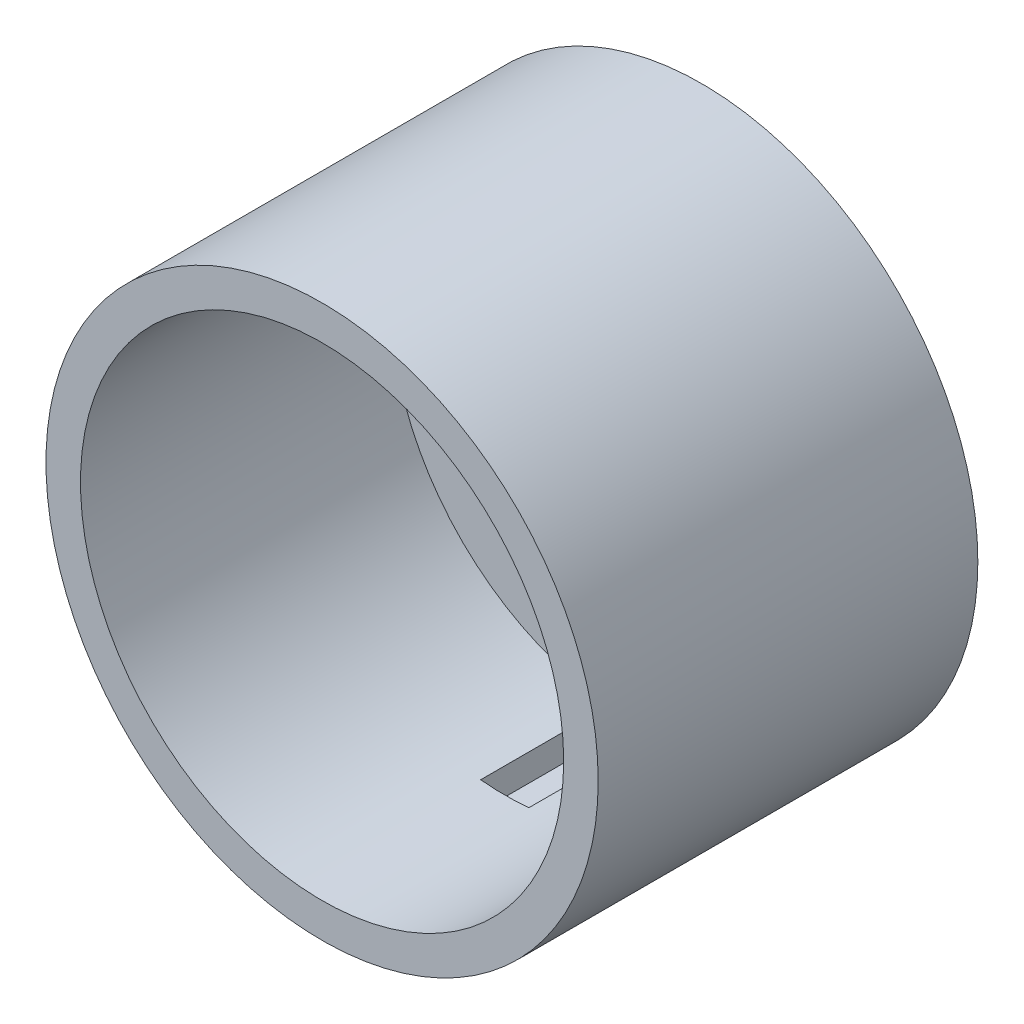
ISO-10303-21;
HEADER;
FILE_DESCRIPTION(('STEP AP214'),'2;1');
FILE_NAME('part.step','',(''),(''),'','','');
FILE_SCHEMA(('AUTOMOTIVE_DESIGN { 1 0 10303 214 1 1 1 1 }'));
ENDSEC;
DATA;
#1=APPLICATION_CONTEXT('core data for automotive mechanical design processes');
#2=APPLICATION_PROTOCOL_DEFINITION('international standard','automotive_design',2000,#1);
#3=PRODUCT_CONTEXT('',#1,'mechanical');
#4=PRODUCT('Part','Part','',(#3));
#5=PRODUCT_RELATED_PRODUCT_CATEGORY('part','',(#4));
#6=PRODUCT_DEFINITION_FORMATION('','',#4);
#7=PRODUCT_DEFINITION_CONTEXT('part definition',#1,'design');
#8=PRODUCT_DEFINITION('design','',#6,#7);
#9=PRODUCT_DEFINITION_SHAPE('','',#8);
#10=(LENGTH_UNIT() NAMED_UNIT(*) SI_UNIT(.MILLI.,.METRE.));
#11=(NAMED_UNIT(*) PLANE_ANGLE_UNIT() SI_UNIT($,.RADIAN.));
#12=(NAMED_UNIT(*) SI_UNIT($,.STERADIAN.) SOLID_ANGLE_UNIT());
#13=UNCERTAINTY_MEASURE_WITH_UNIT(LENGTH_MEASURE(1.E-05),#10,'distance_accuracy_value','');
#14=(GEOMETRIC_REPRESENTATION_CONTEXT(3) GLOBAL_UNCERTAINTY_ASSIGNED_CONTEXT((#13)) GLOBAL_UNIT_ASSIGNED_CONTEXT((#10,
#11,#12)) REPRESENTATION_CONTEXT('',''));
#15=CARTESIAN_POINT('',(0.,0.,0.));
#16=DIRECTION('',(0.,0.,1.));
#17=DIRECTION('',(1.,0.,0.));
#18=AXIS2_PLACEMENT_3D('',#15,#16,#17);
#19=CARTESIAN_POINT('',(-1.4,15.5,11.41));
#20=DIRECTION('',(1.,0.,0.));
#21=DIRECTION('',(0.,1.,0.));
#22=AXIS2_PLACEMENT_3D('',#19,#20,#21);
#23=PLANE('',#22);
#24=DIRECTION('',(0.,0.,1.));
#25=VECTOR('',#24,1.);
#26=CARTESIAN_POINT('',(-1.4,13.9298241194927,4.));
#27=LINE('',#26,#25);
#28=CARTESIAN_POINT('',(-1.4,13.9298241194927,4.));
#29=VERTEX_POINT('',#28);
#30=CARTESIAN_POINT('',(-1.4,13.9298241194927,11.41));
#31=VERTEX_POINT('',#30);
#32=EDGE_CURVE('E130',#29,#31,#27,.T.);
#33=ORIENTED_EDGE('',*,*,#32,.F.);
#34=DIRECTION('',(0.,-1.,0.));
#35=VECTOR('',#34,1.);
#36=CARTESIAN_POINT('',(-1.4,15.5,4.));
#37=LINE('',#36,#35);
#38=CARTESIAN_POINT('',(-1.4,5.,4.));
#39=VERTEX_POINT('',#38);
#40=EDGE_CURVE('E143',#29,#39,#37,.T.);
#41=ORIENTED_EDGE('',*,*,#40,.T.);
#42=DIRECTION('',(0.,0.,-1.));
#43=VECTOR('',#42,1.);
#44=CARTESIAN_POINT('',(-1.4,5.,5.));
#45=LINE('',#44,#43);
#46=CARTESIAN_POINT('',(-1.4,5.,0.));
#47=VERTEX_POINT('',#46);
#48=EDGE_CURVE('E214',#39,#47,#45,.T.);
#49=ORIENTED_EDGE('',*,*,#48,.T.);
#50=DIRECTION('',(0.,-1.,0.));
#51=VECTOR('',#50,1.);
#52=CARTESIAN_POINT('',(-1.4,15.5,0.));
#53=LINE('',#52,#51);
#54=CARTESIAN_POINT('',(-1.4,15.5,0.));
#55=VERTEX_POINT('',#54);
#56=EDGE_CURVE('E195',#55,#47,#53,.T.);
#57=ORIENTED_EDGE('',*,*,#56,.F.);
#58=DIRECTION('',(0.,0.,-1.));
#59=VECTOR('',#58,1.);
#60=CARTESIAN_POINT('',(-1.4,15.5,11.41));
#61=LINE('',#60,#59);
#62=CARTESIAN_POINT('',(-1.4,15.5,11.41));
#63=VERTEX_POINT('',#62);
#64=EDGE_CURVE('E180',#63,#55,#61,.T.);
#65=ORIENTED_EDGE('',*,*,#64,.F.);
#66=DIRECTION('',(0.,-1.,0.));
#67=VECTOR('',#66,1.);
#68=CARTESIAN_POINT('',(-1.4,15.5,11.41));
#69=LINE('',#68,#67);
#70=EDGE_CURVE('E206',#63,#31,#69,.T.);
#71=ORIENTED_EDGE('',*,*,#70,.T.);
#72=EDGE_LOOP('',(#33,#41,#49,#57,#65,#71));
#73=FACE_BOUND('',#72,.T.);
#74=ADVANCED_FACE('F33',(#73),#23,.T.);
#75=CARTESIAN_POINT('',(1.4,15.5,11.41));
#76=DIRECTION('',(-1.,0.,0.));
#77=DIRECTION('',(0.,-1.,0.));
#78=AXIS2_PLACEMENT_3D('',#75,#76,#77);
#79=PLANE('',#78);
#80=DIRECTION('',(0.,0.,1.));
#81=VECTOR('',#80,1.);
#82=CARTESIAN_POINT('',(1.4,-13.9298241194927,4.));
#83=LINE('',#82,#81);
#84=CARTESIAN_POINT('',(1.4,-13.9298241194927,4.));
#85=VERTEX_POINT('',#84);
#86=CARTESIAN_POINT('',(1.4,-13.9298241194927,11.41));
#87=VERTEX_POINT('',#86);
#88=EDGE_CURVE('E147',#85,#87,#83,.T.);
#89=ORIENTED_EDGE('',*,*,#88,.F.);
#90=DIRECTION('',(0.,1.,0.));
#91=VECTOR('',#90,1.);
#92=CARTESIAN_POINT('',(1.4,15.5,4.));
#93=LINE('',#92,#91);
#94=CARTESIAN_POINT('',(1.4,3.3,4.));
#95=VERTEX_POINT('',#94);
#96=EDGE_CURVE('E135',#85,#95,#93,.T.);
#97=ORIENTED_EDGE('',*,*,#96,.T.);
#98=DIRECTION('',(0.,0.,-1.));
#99=VECTOR('',#98,1.);
#100=CARTESIAN_POINT('',(1.4,3.3,5.));
#101=LINE('',#100,#99);
#102=CARTESIAN_POINT('',(1.4,3.3,0.));
#103=VERTEX_POINT('',#102);
#104=EDGE_CURVE('E209',#95,#103,#101,.T.);
#105=ORIENTED_EDGE('',*,*,#104,.T.);
#106=DIRECTION('',(0.,1.,0.));
#107=VECTOR('',#106,1.);
#108=CARTESIAN_POINT('',(1.4,15.5,0.));
#109=LINE('',#108,#107);
#110=CARTESIAN_POINT('',(1.4,-15.5,0.));
#111=VERTEX_POINT('',#110);
#112=EDGE_CURVE('E188',#111,#103,#109,.T.);
#113=ORIENTED_EDGE('',*,*,#112,.F.);
#114=DIRECTION('',(0.,0.,-1.));
#115=VECTOR('',#114,1.);
#116=CARTESIAN_POINT('',(1.4,-15.5,11.41));
#117=LINE('',#116,#115);
#118=CARTESIAN_POINT('',(1.4,-15.5,11.41));
#119=VERTEX_POINT('',#118);
#120=EDGE_CURVE('E175',#119,#111,#117,.T.);
#121=ORIENTED_EDGE('',*,*,#120,.F.);
#122=DIRECTION('',(0.,1.,0.));
#123=VECTOR('',#122,1.);
#124=CARTESIAN_POINT('',(1.4,15.5,11.41));
#125=LINE('',#124,#123);
#126=EDGE_CURVE('E200',#119,#87,#125,.T.);
#127=ORIENTED_EDGE('',*,*,#126,.T.);
#128=EDGE_LOOP('',(#89,#97,#105,#113,#121,#127));
#129=FACE_BOUND('',#128,.T.);
#130=ADVANCED_FACE('F232',(#129),#79,.T.);
#131=CARTESIAN_POINT('',(0.,0.,11.41));
#132=DIRECTION('',(0.,0.,1.));
#133=DIRECTION('',(1.,0.,0.));
#134=AXIS2_PLACEMENT_3D('',#131,#132,#133);
#135=PLANE('',#134);
#136=CARTESIAN_POINT('',(1.4,13.9298241194927,11.41));
#137=VERTEX_POINT('',#136);
#138=CARTESIAN_POINT('',(1.4,15.5,11.41));
#139=VERTEX_POINT('',#138);
#140=EDGE_CURVE('E203',#137,#139,#125,.T.);
#141=ORIENTED_EDGE('',*,*,#140,.F.);
#142=CARTESIAN_POINT('',(0.,0.,11.41));
#143=DIRECTION('',(0.,0.,1.));
#144=DIRECTION('',(1.,0.,0.));
#145=AXIS2_PLACEMENT_3D('',#142,#143,#144);
#146=CIRCLE('',#145,14.);
#147=EDGE_CURVE('E11',#137,#31,#146,.T.);
#148=ORIENTED_EDGE('',*,*,#147,.T.);
#149=ORIENTED_EDGE('',*,*,#70,.F.);
#150=DIRECTION('',(-1.,0.,0.));
#151=VECTOR('',#150,1.);
#152=CARTESIAN_POINT('',(-1.4,15.5,11.41));
#153=LINE('',#152,#151);
#154=EDGE_CURVE('E183',#139,#63,#153,.T.);
#155=ORIENTED_EDGE('',*,*,#154,.F.);
#156=EDGE_LOOP('',(#141,#148,#149,#155));
#157=FACE_BOUND('',#156,.T.);
#158=ADVANCED_FACE('F248',(#157),#135,.F.);
#159=CARTESIAN_POINT('',(1.4,5.,5.));
#160=DIRECTION('',(0.,1.,0.));
#161=DIRECTION('',(-1.,0.,0.));
#162=AXIS2_PLACEMENT_3D('',#159,#160,#161);
#163=PLANE('',#162);
#164=ORIENTED_EDGE('',*,*,#48,.F.);
#165=DIRECTION('',(1.,0.,0.));
#166=VECTOR('',#165,1.);
#167=CARTESIAN_POINT('',(1.4,5.,4.));
#168=LINE('',#167,#166);
#169=CARTESIAN_POINT('',(1.4,5.,4.));
#170=VERTEX_POINT('',#169);
#171=EDGE_CURVE('E144',#39,#170,#168,.T.);
#172=ORIENTED_EDGE('',*,*,#171,.T.);
#173=DIRECTION('',(0.,0.,-1.));
#174=VECTOR('',#173,1.);
#175=CARTESIAN_POINT('',(1.4,5.,5.));
#176=LINE('',#175,#174);
#177=CARTESIAN_POINT('',(1.4,5.,0.));
#178=VERTEX_POINT('',#177);
#179=EDGE_CURVE('E142',#170,#178,#176,.T.);
#180=ORIENTED_EDGE('',*,*,#179,.T.);
#181=DIRECTION('',(1.,0.,0.));
#182=VECTOR('',#181,1.);
#183=CARTESIAN_POINT('',(1.4,5.,0.));
#184=LINE('',#183,#182);
#185=EDGE_CURVE('E212',#47,#178,#184,.T.);
#186=ORIENTED_EDGE('',*,*,#185,.F.);
#187=EDGE_LOOP('',(#164,#172,#180,#186));
#188=FACE_BOUND('',#187,.T.);
#189=ADVANCED_FACE('F258',(#188),#163,.T.);
#190=CARTESIAN_POINT('',(1.4,3.3,5.));
#191=DIRECTION('',(0.,-1.,0.));
#192=DIRECTION('',(1.,0.,0.));
#193=AXIS2_PLACEMENT_3D('',#190,#191,#192);
#194=PLANE('',#193);
#195=ORIENTED_EDGE('',*,*,#104,.F.);
#196=DIRECTION('',(-1.,0.,0.));
#197=VECTOR('',#196,1.);
#198=CARTESIAN_POINT('',(1.4,3.3,4.));
#199=LINE('',#198,#197);
#200=CARTESIAN_POINT('',(-1.4,3.3,4.));
#201=VERTEX_POINT('',#200);
#202=EDGE_CURVE('E166',#95,#201,#199,.T.);
#203=ORIENTED_EDGE('',*,*,#202,.T.);
#204=DIRECTION('',(0.,0.,-1.));
#205=VECTOR('',#204,1.);
#206=CARTESIAN_POINT('',(-1.4,3.3,5.));
#207=LINE('',#206,#205);
#208=CARTESIAN_POINT('',(-1.4,3.3,0.));
#209=VERTEX_POINT('',#208);
#210=EDGE_CURVE('E211',#201,#209,#207,.T.);
#211=ORIENTED_EDGE('',*,*,#210,.T.);
#212=DIRECTION('',(-1.,0.,0.));
#213=VECTOR('',#212,1.);
#214=CARTESIAN_POINT('',(1.4,3.3,0.));
#215=LINE('',#214,#213);
#216=EDGE_CURVE('E219',#103,#209,#215,.T.);
#217=ORIENTED_EDGE('',*,*,#216,.F.);
#218=EDGE_LOOP('',(#195,#203,#211,#217));
#219=FACE_BOUND('',#218,.T.);
#220=ADVANCED_FACE('F260',(#219),#194,.T.);
#221=CARTESIAN_POINT('',(0.,0.,0.));
#222=DIRECTION('',(0.,0.,1.));
#223=DIRECTION('',(1.,0.,0.));
#224=AXIS2_PLACEMENT_3D('',#221,#222,#223);
#225=PLANE('',#224);
#226=ORIENTED_EDGE('',*,*,#56,.T.);
#227=ORIENTED_EDGE('',*,*,#185,.T.);
#228=CARTESIAN_POINT('',(1.4,15.5,0.));
#229=VERTEX_POINT('',#228);
#230=EDGE_CURVE('E191',#178,#229,#109,.T.);
#231=ORIENTED_EDGE('',*,*,#230,.T.);
#232=DIRECTION('',(-1.,0.,0.));
#233=VECTOR('',#232,1.);
#234=CARTESIAN_POINT('',(-1.4,15.5,0.));
#235=LINE('',#234,#233);
#236=EDGE_CURVE('E184',#229,#55,#235,.T.);
#237=ORIENTED_EDGE('',*,*,#236,.T.);
#238=EDGE_LOOP('',(#226,#227,#231,#237));
#239=FACE_BOUND('',#238,.T.);
#240=CARTESIAN_POINT('',(0.,0.,0.));
#241=DIRECTION('',(0.,0.,1.));
#242=DIRECTION('',(1.,0.,0.));
#243=AXIS2_PLACEMENT_3D('',#240,#241,#242);
#244=CIRCLE('',#243,16.);
#245=CARTESIAN_POINT('',(16.,0.,0.));
#246=VERTEX_POINT('',#245);
#247=EDGE_CURVE('E167',#246,#246,#244,.T.);
#248=ORIENTED_EDGE('',*,*,#247,.F.);
#249=EDGE_LOOP('',(#248));
#250=FACE_BOUND('',#249,.T.);
#251=ORIENTED_EDGE('',*,*,#216,.T.);
#252=CARTESIAN_POINT('',(-1.4,-15.5,0.));
#253=VERTEX_POINT('',#252);
#254=EDGE_CURVE('E198',#209,#253,#53,.T.);
#255=ORIENTED_EDGE('',*,*,#254,.T.);
#256=DIRECTION('',(1.,0.,0.));
#257=VECTOR('',#256,1.);
#258=CARTESIAN_POINT('',(-1.4,-15.5,0.));
#259=LINE('',#258,#257);
#260=EDGE_CURVE('E192',#253,#111,#259,.T.);
#261=ORIENTED_EDGE('',*,*,#260,.T.);
#262=ORIENTED_EDGE('',*,*,#112,.T.);
#263=EDGE_LOOP('',(#251,#255,#261,#262));
#264=FACE_BOUND('',#263,.T.);
#265=ADVANCED_FACE('F254',(#239,#250,#264),#225,.F.);
#266=CARTESIAN_POINT('',(0.,0.,22.));
#267=DIRECTION('',(0.,0.,-1.));
#268=DIRECTION('',(-1.,0.,0.));
#269=AXIS2_PLACEMENT_3D('',#266,#267,#268);
#270=CYLINDRICAL_SURFACE('',#269,16.);
#271=CARTESIAN_POINT('',(0.,0.,22.));
#272=DIRECTION('',(0.,0.,1.));
#273=DIRECTION('',(1.,0.,0.));
#274=AXIS2_PLACEMENT_3D('',#271,#272,#273);
#275=CIRCLE('',#274,16.);
#276=CARTESIAN_POINT('',(16.,0.,22.));
#277=VERTEX_POINT('',#276);
#278=EDGE_CURVE('E164',#277,#277,#275,.T.);
#279=ORIENTED_EDGE('',*,*,#278,.F.);
#280=EDGE_LOOP('',(#279));
#281=FACE_BOUND('',#280,.T.);
#282=ORIENTED_EDGE('',*,*,#247,.T.);
#283=EDGE_LOOP('',(#282));
#284=FACE_BOUND('',#283,.T.);
#285=ADVANCED_FACE('F35',(#281,#284),#270,.T.);
#286=CARTESIAN_POINT('',(0.,0.,22.));
#287=DIRECTION('',(0.,0.,1.));
#288=DIRECTION('',(1.,0.,0.));
#289=AXIS2_PLACEMENT_3D('',#286,#287,#288);
#290=PLANE('',#289);
#291=CARTESIAN_POINT('',(0.,0.,22.));
#292=DIRECTION('',(0.,0.,1.));
#293=DIRECTION('',(1.,0.,0.));
#294=AXIS2_PLACEMENT_3D('',#291,#292,#293);
#295=CIRCLE('',#294,14.);
#296=CARTESIAN_POINT('',(14.,0.,22.));
#297=VERTEX_POINT('',#296);
#298=EDGE_CURVE('E137',#297,#297,#295,.T.);
#299=ORIENTED_EDGE('',*,*,#298,.F.);
#300=EDGE_LOOP('',(#299));
#301=FACE_BOUND('',#300,.T.);
#302=ORIENTED_EDGE('',*,*,#278,.T.);
#303=EDGE_LOOP('',(#302));
#304=FACE_BOUND('',#303,.T.);
#305=ADVANCED_FACE('F157',(#301,#304),#290,.T.);
#306=DIRECTION('',(0.,0.,1.));
#307=VECTOR('',#306,1.);
#308=CARTESIAN_POINT('',(-1.4,-13.9298241194927,4.));
#309=LINE('',#308,#307);
#310=CARTESIAN_POINT('',(-1.4,-13.9298241194927,11.41));
#311=VERTEX_POINT('',#310);
#312=CARTESIAN_POINT('',(-1.4,-13.9298241194927,4.));
#313=VERTEX_POINT('',#312);
#314=EDGE_CURVE('E131',#311,#313,#309,.F.);
#315=ORIENTED_EDGE('',*,*,#314,.F.);
#316=CARTESIAN_POINT('',(-1.4,-15.5,11.41));
#317=VERTEX_POINT('',#316);
#318=EDGE_CURVE('E187',#311,#317,#69,.T.);
#319=ORIENTED_EDGE('',*,*,#318,.T.);
#320=DIRECTION('',(0.,0.,-1.));
#321=VECTOR('',#320,1.);
#322=CARTESIAN_POINT('',(-1.4,-15.5,11.41));
#323=LINE('',#322,#321);
#324=EDGE_CURVE('E170',#317,#253,#323,.T.);
#325=ORIENTED_EDGE('',*,*,#324,.T.);
#326=ORIENTED_EDGE('',*,*,#254,.F.);
#327=ORIENTED_EDGE('',*,*,#210,.F.);
#328=EDGE_CURVE('E55',#201,#313,#37,.T.);
#329=ORIENTED_EDGE('',*,*,#328,.T.);
#330=EDGE_LOOP('',(#315,#319,#325,#326,#327,#329));
#331=FACE_BOUND('',#330,.T.);
#332=ADVANCED_FACE('F160',(#331),#23,.T.);
#333=CARTESIAN_POINT('',(-1.4,-15.5,11.41));
#334=DIRECTION('',(0.,1.,0.));
#335=DIRECTION('',(0.,0.,1.));
#336=AXIS2_PLACEMENT_3D('',#333,#334,#335);
#337=PLANE('',#336);
#338=ORIENTED_EDGE('',*,*,#260,.F.);
#339=ORIENTED_EDGE('',*,*,#324,.F.);
#340=DIRECTION('',(1.,0.,0.));
#341=VECTOR('',#340,1.);
#342=CARTESIAN_POINT('',(-1.4,-15.5,11.41));
#343=LINE('',#342,#341);
#344=EDGE_CURVE('E204',#317,#119,#343,.T.);
#345=ORIENTED_EDGE('',*,*,#344,.T.);
#346=ORIENTED_EDGE('',*,*,#120,.T.);
#347=EDGE_LOOP('',(#338,#339,#345,#346));
#348=FACE_BOUND('',#347,.T.);
#349=ADVANCED_FACE('F236',(#348),#337,.T.);
#350=DIRECTION('',(0.,0.,1.));
#351=VECTOR('',#350,1.);
#352=CARTESIAN_POINT('',(1.4,13.9298241194927,4.));
#353=LINE('',#352,#351);
#354=CARTESIAN_POINT('',(1.4,13.9298241194927,4.));
#355=VERTEX_POINT('',#354);
#356=EDGE_CURVE('E123',#137,#355,#353,.F.);
#357=ORIENTED_EDGE('',*,*,#356,.F.);
#358=ORIENTED_EDGE('',*,*,#140,.T.);
#359=DIRECTION('',(0.,0.,-1.));
#360=VECTOR('',#359,1.);
#361=CARTESIAN_POINT('',(1.4,15.5,11.41));
#362=LINE('',#361,#360);
#363=EDGE_CURVE('E177',#139,#229,#362,.T.);
#364=ORIENTED_EDGE('',*,*,#363,.T.);
#365=ORIENTED_EDGE('',*,*,#230,.F.);
#366=ORIENTED_EDGE('',*,*,#179,.F.);
#367=EDGE_CURVE('E48',#170,#355,#93,.T.);
#368=ORIENTED_EDGE('',*,*,#367,.T.);
#369=EDGE_LOOP('',(#357,#358,#364,#365,#366,#368));
#370=FACE_BOUND('',#369,.T.);
#371=ADVANCED_FACE('F140',(#370),#79,.T.);
#372=CARTESIAN_POINT('',(-1.4,15.5,11.41));
#373=DIRECTION('',(0.,-1.,0.));
#374=DIRECTION('',(0.,0.,-1.));
#375=AXIS2_PLACEMENT_3D('',#372,#373,#374);
#376=PLANE('',#375);
#377=ORIENTED_EDGE('',*,*,#236,.F.);
#378=ORIENTED_EDGE('',*,*,#363,.F.);
#379=ORIENTED_EDGE('',*,*,#154,.T.);
#380=ORIENTED_EDGE('',*,*,#64,.T.);
#381=EDGE_LOOP('',(#377,#378,#379,#380));
#382=FACE_BOUND('',#381,.T.);
#383=ADVANCED_FACE('F252',(#382),#376,.T.);
#384=ORIENTED_EDGE('',*,*,#318,.F.);
#385=EDGE_CURVE('E37',#311,#87,#146,.T.);
#386=ORIENTED_EDGE('',*,*,#385,.T.);
#387=ORIENTED_EDGE('',*,*,#126,.F.);
#388=ORIENTED_EDGE('',*,*,#344,.F.);
#389=EDGE_LOOP('',(#384,#386,#387,#388));
#390=FACE_BOUND('',#389,.T.);
#391=ADVANCED_FACE('F229',(#390),#135,.F.);
#392=CARTESIAN_POINT('',(0.,0.,4.));
#393=DIRECTION('',(0.,0.,1.));
#394=DIRECTION('',(1.,0.,0.));
#395=AXIS2_PLACEMENT_3D('',#392,#393,#394);
#396=CYLINDRICAL_SURFACE('',#395,14.);
#397=ORIENTED_EDGE('',*,*,#32,.T.);
#398=ORIENTED_EDGE('',*,*,#147,.F.);
#399=ORIENTED_EDGE('',*,*,#356,.T.);
#400=CARTESIAN_POINT('',(0.,0.,4.));
#401=DIRECTION('',(0.,0.,1.));
#402=DIRECTION('',(1.,0.,0.));
#403=AXIS2_PLACEMENT_3D('',#400,#401,#402);
#404=CIRCLE('',#403,14.);
#405=EDGE_CURVE('E126',#85,#355,#404,.T.);
#406=ORIENTED_EDGE('',*,*,#405,.F.);
#407=ORIENTED_EDGE('',*,*,#88,.T.);
#408=ORIENTED_EDGE('',*,*,#385,.F.);
#409=ORIENTED_EDGE('',*,*,#314,.T.);
#410=EDGE_CURVE('E136',#29,#313,#404,.T.);
#411=ORIENTED_EDGE('',*,*,#410,.F.);
#412=EDGE_LOOP('',(#397,#398,#399,#406,#407,#408,#409,#411));
#413=FACE_BOUND('',#412,.T.);
#414=ORIENTED_EDGE('',*,*,#298,.T.);
#415=EDGE_LOOP('',(#414));
#416=FACE_BOUND('',#415,.T.);
#417=ADVANCED_FACE('F124',(#413,#416),#396,.F.);
#418=CARTESIAN_POINT('',(0.,0.,4.));
#419=DIRECTION('',(0.,0.,1.));
#420=DIRECTION('',(1.,0.,0.));
#421=AXIS2_PLACEMENT_3D('',#418,#419,#420);
#422=PLANE('',#421);
#423=ORIENTED_EDGE('',*,*,#410,.T.);
#424=ORIENTED_EDGE('',*,*,#328,.F.);
#425=ORIENTED_EDGE('',*,*,#202,.F.);
#426=ORIENTED_EDGE('',*,*,#96,.F.);
#427=ORIENTED_EDGE('',*,*,#405,.T.);
#428=ORIENTED_EDGE('',*,*,#367,.F.);
#429=ORIENTED_EDGE('',*,*,#171,.F.);
#430=ORIENTED_EDGE('',*,*,#40,.F.);
#431=EDGE_LOOP('',(#423,#424,#425,#426,#427,#428,#429,#430));
#432=FACE_BOUND('',#431,.T.);
#433=ADVANCED_FACE('F133',(#432),#422,.T.);
#434=CLOSED_SHELL('',(#74,#130,#158,#189,#220,#265,#285,#305,#332,#349,#371,#383,#391,#417,#433));
#435=MANIFOLD_SOLID_BREP('B2',#434);
#436=ADVANCED_BREP_SHAPE_REPRESENTATION('',(#18,#435),#14);
#437=SHAPE_DEFINITION_REPRESENTATION(#9,#436);
ENDSEC;
END-ISO-10303-21;
